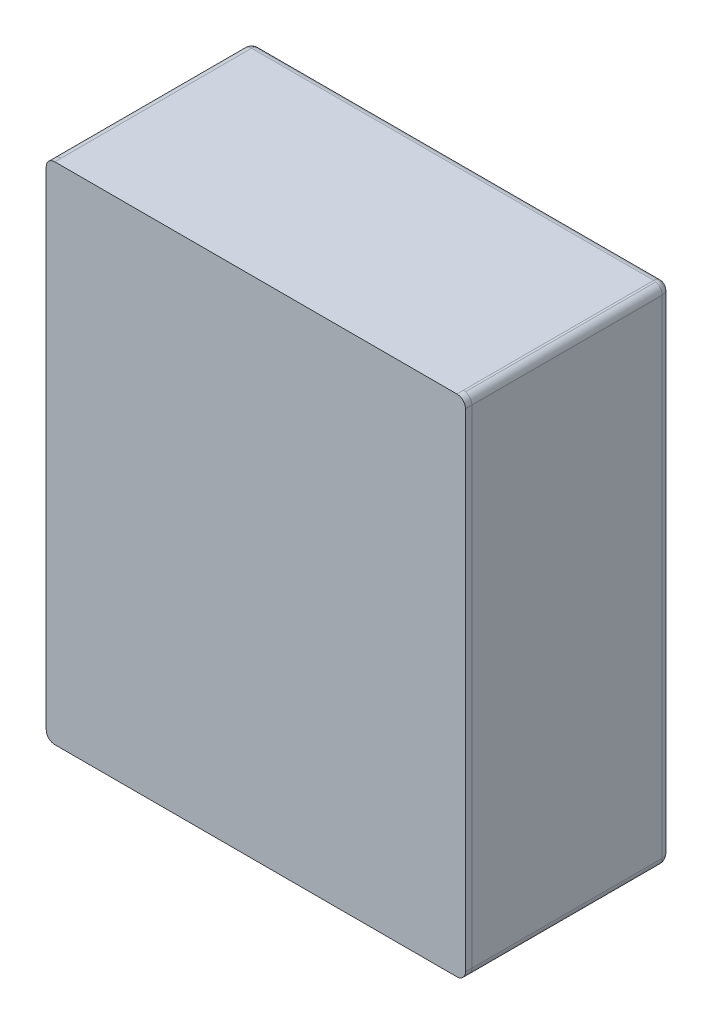
ISO-10303-21;
HEADER;
FILE_DESCRIPTION(('STEP AP214'),'2;1');
FILE_NAME('part.step','',(''),(''),'','','');
FILE_SCHEMA(('AUTOMOTIVE_DESIGN { 1 0 10303 214 1 1 1 1 }'));
ENDSEC;
DATA;
#1=APPLICATION_CONTEXT('core data for automotive mechanical design processes');
#2=APPLICATION_PROTOCOL_DEFINITION('international standard','automotive_design',2000,#1);
#3=PRODUCT_CONTEXT('',#1,'mechanical');
#4=PRODUCT('Part','Part','',(#3));
#5=PRODUCT_RELATED_PRODUCT_CATEGORY('part','',(#4));
#6=PRODUCT_DEFINITION_FORMATION('','',#4);
#7=PRODUCT_DEFINITION_CONTEXT('part definition',#1,'design');
#8=PRODUCT_DEFINITION('design','',#6,#7);
#9=PRODUCT_DEFINITION_SHAPE('','',#8);
#10=(LENGTH_UNIT() NAMED_UNIT(*) SI_UNIT(.MILLI.,.METRE.));
#11=(NAMED_UNIT(*) PLANE_ANGLE_UNIT() SI_UNIT($,.RADIAN.));
#12=(NAMED_UNIT(*) SI_UNIT($,.STERADIAN.) SOLID_ANGLE_UNIT());
#13=UNCERTAINTY_MEASURE_WITH_UNIT(LENGTH_MEASURE(1.E-05),#10,'distance_accuracy_value','');
#14=(GEOMETRIC_REPRESENTATION_CONTEXT(3) GLOBAL_UNCERTAINTY_ASSIGNED_CONTEXT((#13)) GLOBAL_UNIT_ASSIGNED_CONTEXT((#10,
#11,#12)) REPRESENTATION_CONTEXT('',''));
#15=CARTESIAN_POINT('',(0.,0.,0.));
#16=DIRECTION('',(0.,0.,1.));
#17=DIRECTION('',(1.,0.,0.));
#18=AXIS2_PLACEMENT_3D('',#15,#16,#17);
#19=CARTESIAN_POINT('',(0.,-3.81,5.08));
#20=DIRECTION('',(0.,0.,-1.));
#21=DIRECTION('',(-1.,0.,0.));
#22=AXIS2_PLACEMENT_3D('',#19,#20,#21);
#23=PLANE('',#22);
#24=CARTESIAN_POINT('',(-1.27,1.27,5.08));
#25=DIRECTION('',(0.,0.,-1.));
#26=DIRECTION('',(-1.,0.,0.));
#27=AXIS2_PLACEMENT_3D('',#24,#25,#26);
#28=CIRCLE('',#27,5.08);
#29=CARTESIAN_POINT('',(0.,-3.64868884968342,5.08));
#30=VERTEX_POINT('',#29);
#31=CARTESIAN_POINT('',(3.81,1.27,5.08));
#32=VERTEX_POINT('',#31);
#33=EDGE_CURVE('E109',#30,#32,#28,.F.);
#34=ORIENTED_EDGE('',*,*,#33,.F.);
#35=DIRECTION('',(0.,1.,0.));
#36=VECTOR('',#35,1.);
#37=CARTESIAN_POINT('',(0.,-3.81,5.08));
#38=LINE('',#37,#36);
#39=CARTESIAN_POINT('',(0.,295.748688849683,5.08));
#40=VERTEX_POINT('',#39);
#41=EDGE_CURVE('E12',#30,#40,#38,.T.);
#42=ORIENTED_EDGE('',*,*,#41,.T.);
#43=CARTESIAN_POINT('',(-1.27,290.83,5.08));
#44=DIRECTION('',(0.,0.,-1.));
#45=DIRECTION('',(-1.,0.,0.));
#46=AXIS2_PLACEMENT_3D('',#43,#44,#45);
#47=CIRCLE('',#46,5.08);
#48=CARTESIAN_POINT('',(3.81,290.83,5.08));
#49=VERTEX_POINT('',#48);
#50=EDGE_CURVE('E78',#49,#40,#47,.F.);
#51=ORIENTED_EDGE('',*,*,#50,.F.);
#52=DIRECTION('',(0.,1.,0.));
#53=VECTOR('',#52,1.);
#54=CARTESIAN_POINT('',(3.81,-3.81,5.08));
#55=LINE('',#54,#53);
#56=EDGE_CURVE('E82',#32,#49,#55,.T.);
#57=ORIENTED_EDGE('',*,*,#56,.F.);
#58=EDGE_LOOP('',(#34,#42,#51,#57));
#59=FACE_BOUND('',#58,.T.);
#60=ADVANCED_FACE('F62',(#59),#23,.T.);
#61=CARTESIAN_POINT('',(0.,-3.81,118.11));
#62=DIRECTION('',(0.,0.,1.));
#63=DIRECTION('',(1.,0.,0.));
#64=AXIS2_PLACEMENT_3D('',#61,#62,#63);
#65=PLANE('',#64);
#66=CARTESIAN_POINT('',(-1.27,290.83,118.11));
#67=DIRECTION('',(0.,0.,1.));
#68=DIRECTION('',(1.,0.,0.));
#69=AXIS2_PLACEMENT_3D('',#66,#67,#68);
#70=CIRCLE('',#69,5.08);
#71=CARTESIAN_POINT('',(3.81,290.83,118.11));
#72=VERTEX_POINT('',#71);
#73=CARTESIAN_POINT('',(0.,295.748688849683,118.11));
#74=VERTEX_POINT('',#73);
#75=EDGE_CURVE('E121',#72,#74,#70,.T.);
#76=ORIENTED_EDGE('',*,*,#75,.T.);
#77=DIRECTION('',(0.,1.,0.));
#78=VECTOR('',#77,1.);
#79=CARTESIAN_POINT('',(0.,-3.81,118.11));
#80=LINE('',#79,#78);
#81=CARTESIAN_POINT('',(0.,-3.64868884968342,118.11));
#82=VERTEX_POINT('',#81);
#83=EDGE_CURVE('E71',#82,#74,#80,.T.);
#84=ORIENTED_EDGE('',*,*,#83,.F.);
#85=CARTESIAN_POINT('',(-1.27,1.27,118.11));
#86=DIRECTION('',(0.,0.,1.));
#87=DIRECTION('',(1.,0.,0.));
#88=AXIS2_PLACEMENT_3D('',#85,#86,#87);
#89=CIRCLE('',#88,5.08);
#90=CARTESIAN_POINT('',(3.81,1.27,118.11));
#91=VERTEX_POINT('',#90);
#92=EDGE_CURVE('E66',#82,#91,#89,.T.);
#93=ORIENTED_EDGE('',*,*,#92,.T.);
#94=DIRECTION('',(0.,1.,0.));
#95=VECTOR('',#94,1.);
#96=CARTESIAN_POINT('',(3.81,-3.81,118.11));
#97=LINE('',#96,#95);
#98=EDGE_CURVE('E114',#91,#72,#97,.T.);
#99=ORIENTED_EDGE('',*,*,#98,.T.);
#100=EDGE_LOOP('',(#76,#84,#93,#99));
#101=FACE_BOUND('',#100,.T.);
#102=ADVANCED_FACE('F123',(#101),#65,.T.);
#103=CARTESIAN_POINT('',(0.,-3.81,118.11));
#104=DIRECTION('',(-1.,0.,0.));
#105=DIRECTION('',(0.,0.,1.));
#106=AXIS2_PLACEMENT_3D('',#103,#104,#105);
#107=PLANE('',#106);
#108=ORIENTED_EDGE('',*,*,#41,.F.);
#109=DIRECTION('',(0.,0.,-1.));
#110=VECTOR('',#109,1.);
#111=CARTESIAN_POINT('',(0.,-3.64868884968342,118.11));
#112=LINE('',#111,#110);
#113=EDGE_CURVE('E127',#82,#30,#112,.T.);
#114=ORIENTED_EDGE('',*,*,#113,.F.);
#115=ORIENTED_EDGE('',*,*,#83,.T.);
#116=DIRECTION('',(0.,0.,-1.));
#117=VECTOR('',#116,1.);
#118=CARTESIAN_POINT('',(0.,295.748688849683,118.11));
#119=LINE('',#118,#117);
#120=EDGE_CURVE('E120',#40,#74,#119,.F.);
#121=ORIENTED_EDGE('',*,*,#120,.F.);
#122=EDGE_LOOP('',(#108,#114,#115,#121));
#123=FACE_BOUND('',#122,.T.);
#124=ADVANCED_FACE('F135',(#123),#107,.T.);
#125=CARTESIAN_POINT('',(3.81,-3.81,118.11));
#126=DIRECTION('',(-1.,0.,0.));
#127=DIRECTION('',(0.,0.,1.));
#128=AXIS2_PLACEMENT_3D('',#125,#126,#127);
#129=PLANE('',#128);
#130=ORIENTED_EDGE('',*,*,#98,.F.);
#131=DIRECTION('',(0.,0.,-1.));
#132=VECTOR('',#131,1.);
#133=CARTESIAN_POINT('',(3.81,1.27,118.11));
#134=LINE('',#133,#132);
#135=EDGE_CURVE('E103',#91,#32,#134,.T.);
#136=ORIENTED_EDGE('',*,*,#135,.T.);
#137=ORIENTED_EDGE('',*,*,#56,.T.);
#138=DIRECTION('',(0.,0.,-1.));
#139=VECTOR('',#138,1.);
#140=CARTESIAN_POINT('',(3.81,290.83,118.11));
#141=LINE('',#140,#139);
#142=EDGE_CURVE('E111',#49,#72,#141,.F.);
#143=ORIENTED_EDGE('',*,*,#142,.T.);
#144=EDGE_LOOP('',(#130,#136,#137,#143));
#145=FACE_BOUND('',#144,.T.);
#146=ADVANCED_FACE('F115',(#145),#129,.F.);
#147=CARTESIAN_POINT('',(-1.27,290.83,118.11));
#148=DIRECTION('',(0.,0.,-1.));
#149=DIRECTION('',(-1.,0.,0.));
#150=AXIS2_PLACEMENT_3D('',#147,#148,#149);
#151=CYLINDRICAL_SURFACE('',#150,5.08);
#152=ORIENTED_EDGE('',*,*,#50,.T.);
#153=ORIENTED_EDGE('',*,*,#120,.T.);
#154=ORIENTED_EDGE('',*,*,#75,.F.);
#155=ORIENTED_EDGE('',*,*,#142,.F.);
#156=EDGE_LOOP('',(#152,#153,#154,#155));
#157=FACE_BOUND('',#156,.T.);
#158=ADVANCED_FACE('F64',(#157),#151,.T.);
#159=CARTESIAN_POINT('',(-1.27,1.27,118.11));
#160=DIRECTION('',(0.,0.,-1.));
#161=DIRECTION('',(-1.,0.,0.));
#162=AXIS2_PLACEMENT_3D('',#159,#160,#161);
#163=CYLINDRICAL_SURFACE('',#162,5.08);
#164=ORIENTED_EDGE('',*,*,#92,.F.);
#165=ORIENTED_EDGE('',*,*,#113,.T.);
#166=ORIENTED_EDGE('',*,*,#33,.T.);
#167=ORIENTED_EDGE('',*,*,#135,.F.);
#168=EDGE_LOOP('',(#164,#165,#166,#167));
#169=FACE_BOUND('',#168,.T.);
#170=ADVANCED_FACE('F105',(#169),#163,.T.);
#171=CLOSED_SHELL('',(#60,#102,#124,#146,#158,#170));
#172=MANIFOLD_SOLID_BREP('B2',#171);
#173=CARTESIAN_POINT('',(0.,-3.81,5.08));
#174=DIRECTION('',(0.,0.,-1.));
#175=DIRECTION('',(-1.,0.,0.));
#176=AXIS2_PLACEMENT_3D('',#173,#174,#175);
#177=PLANE('',#176);
#178=CARTESIAN_POINT('',(-1.27,1.27,5.08));
#179=DIRECTION('',(0.,0.,-1.));
#180=DIRECTION('',(-1.,0.,0.));
#181=AXIS2_PLACEMENT_3D('',#178,#179,#180);
#182=CIRCLE('',#181,5.08);
#183=CARTESIAN_POINT('',(0.,-3.64868884968342,5.08));
#184=VERTEX_POINT('',#183);
#185=CARTESIAN_POINT('',(3.81,1.27,5.08));
#186=VERTEX_POINT('',#185);
#187=EDGE_CURVE('E418',#184,#186,#182,.F.);
#188=ORIENTED_EDGE('',*,*,#187,.T.);
#189=DIRECTION('',(0.,1.,0.));
#190=VECTOR('',#189,1.);
#191=CARTESIAN_POINT('',(3.81,-3.81,5.08));
#192=LINE('',#191,#190);
#193=CARTESIAN_POINT('',(3.81,290.83,5.08));
#194=VERTEX_POINT('',#193);
#195=EDGE_CURVE('E414',#186,#194,#192,.T.);
#196=ORIENTED_EDGE('',*,*,#195,.T.);
#197=CARTESIAN_POINT('',(-1.27,290.83,5.08));
#198=DIRECTION('',(0.,0.,-1.));
#199=DIRECTION('',(-1.,0.,0.));
#200=AXIS2_PLACEMENT_3D('',#197,#198,#199);
#201=CIRCLE('',#200,5.08);
#202=CARTESIAN_POINT('',(0.,295.748688849683,5.08));
#203=VERTEX_POINT('',#202);
#204=EDGE_CURVE('E411',#194,#203,#201,.F.);
#205=ORIENTED_EDGE('',*,*,#204,.T.);
#206=DIRECTION('',(0.,1.,0.));
#207=VECTOR('',#206,1.);
#208=CARTESIAN_POINT('',(0.,-3.81,5.08));
#209=LINE('',#208,#207);
#210=CARTESIAN_POINT('',(0.,292.1,5.08));
#211=VERTEX_POINT('',#210);
#212=EDGE_CURVE('E60',#211,#203,#209,.T.);
#213=ORIENTED_EDGE('',*,*,#212,.F.);
#214=CARTESIAN_POINT('',(0.,0.,5.08));
#215=VERTEX_POINT('',#214);
#216=EDGE_CURVE('E212',#215,#211,#209,.T.);
#217=ORIENTED_EDGE('',*,*,#216,.F.);
#218=EDGE_CURVE('E210',#184,#215,#209,.T.);
#219=ORIENTED_EDGE('',*,*,#218,.F.);
#220=EDGE_LOOP('',(#188,#196,#205,#213,#217,#219));
#221=FACE_BOUND('',#220,.T.);
#222=ADVANCED_FACE('F200',(#221),#177,.F.);
#223=CARTESIAN_POINT('',(0.,-3.81,118.11));
#224=DIRECTION('',(-1.,0.,0.));
#225=DIRECTION('',(0.,0.,1.));
#226=AXIS2_PLACEMENT_3D('',#223,#224,#225);
#227=PLANE('',#226);
#228=DIRECTION('',(0.,0.,-1.));
#229=VECTOR('',#228,1.);
#230=CARTESIAN_POINT('',(0.,292.1,118.11));
#231=LINE('',#230,#229);
#232=CARTESIAN_POINT('',(0.,292.1,118.11));
#233=VERTEX_POINT('',#232);
#234=EDGE_CURVE('E219',#233,#211,#231,.T.);
#235=ORIENTED_EDGE('',*,*,#234,.T.);
#236=ORIENTED_EDGE('',*,*,#212,.T.);
#237=DIRECTION('',(0.,0.,-1.));
#238=VECTOR('',#237,1.);
#239=CARTESIAN_POINT('',(0.,295.748688849683,118.11));
#240=LINE('',#239,#238);
#241=CARTESIAN_POINT('',(0.,295.748688849683,118.11));
#242=VERTEX_POINT('',#241);
#243=EDGE_CURVE('E204',#203,#242,#240,.F.);
#244=ORIENTED_EDGE('',*,*,#243,.T.);
#245=DIRECTION('',(0.,1.,0.));
#246=VECTOR('',#245,1.);
#247=CARTESIAN_POINT('',(0.,-3.81,118.11));
#248=LINE('',#247,#246);
#249=EDGE_CURVE('E520',#233,#242,#248,.T.);
#250=ORIENTED_EDGE('',*,*,#249,.F.);
#251=EDGE_LOOP('',(#235,#236,#244,#250));
#252=FACE_BOUND('',#251,.T.);
#253=ADVANCED_FACE('F202',(#252),#227,.F.);
#254=CARTESIAN_POINT('',(0.,-3.64868884968342,118.11));
#255=VERTEX_POINT('',#254);
#256=CARTESIAN_POINT('',(0.,0.,118.11));
#257=VERTEX_POINT('',#256);
#258=EDGE_CURVE('E524',#255,#257,#248,.T.);
#259=ORIENTED_EDGE('',*,*,#258,.F.);
#260=DIRECTION('',(0.,0.,-1.));
#261=VECTOR('',#260,1.);
#262=CARTESIAN_POINT('',(0.,-3.64868884968342,118.11));
#263=LINE('',#262,#261);
#264=EDGE_CURVE('E526',#255,#184,#263,.T.);
#265=ORIENTED_EDGE('',*,*,#264,.T.);
#266=ORIENTED_EDGE('',*,*,#218,.T.);
#267=DIRECTION('',(0.,0.,-1.));
#268=VECTOR('',#267,1.);
#269=CARTESIAN_POINT('',(0.,0.,118.11));
#270=LINE('',#269,#268);
#271=EDGE_CURVE('E227',#257,#215,#270,.T.);
#272=ORIENTED_EDGE('',*,*,#271,.F.);
#273=EDGE_LOOP('',(#259,#265,#266,#272));
#274=FACE_BOUND('',#273,.T.);
#275=ADVANCED_FACE('F627',(#274),#227,.F.);
#276=CARTESIAN_POINT('',(-240.03,1.27,5.08));
#277=DIRECTION('',(0.,0.,1.));
#278=DIRECTION('',(1.,0.,0.));
#279=AXIS2_PLACEMENT_3D('',#276,#277,#278);
#280=SPHERICAL_SURFACE('',#279,5.08);
#281=CARTESIAN_POINT('',(-240.03,1.27,5.08));
#282=DIRECTION('',(1.,0.,0.));
#283=DIRECTION('',(0.,0.,-1.));
#284=AXIS2_PLACEMENT_3D('',#281,#282,#283);
#285=CIRCLE('',#284,5.08);
#286=CARTESIAN_POINT('',(-240.03,-3.81,5.08));
#287=VERTEX_POINT('',#286);
#288=CARTESIAN_POINT('',(-240.03,1.27,0.));
#289=VERTEX_POINT('',#288);
#290=EDGE_CURVE('E475',#287,#289,#285,.T.);
#291=ORIENTED_EDGE('',*,*,#290,.F.);
#292=CARTESIAN_POINT('',(-240.03,1.27,5.08));
#293=DIRECTION('',(0.,0.,-1.));
#294=DIRECTION('',(-1.,0.,0.));
#295=AXIS2_PLACEMENT_3D('',#292,#293,#294);
#296=CIRCLE('',#295,5.08);
#297=CARTESIAN_POINT('',(-245.11,1.27,5.08));
#298=VERTEX_POINT('',#297);
#299=EDGE_CURVE('E439',#298,#287,#296,.F.);
#300=ORIENTED_EDGE('',*,*,#299,.F.);
#301=CARTESIAN_POINT('',(-240.03,1.27,5.08));
#302=DIRECTION('',(0.,1.,0.));
#303=DIRECTION('',(0.,0.,1.));
#304=AXIS2_PLACEMENT_3D('',#301,#302,#303);
#305=CIRCLE('',#304,5.08);
#306=EDGE_CURVE('E479',#289,#298,#305,.T.);
#307=ORIENTED_EDGE('',*,*,#306,.F.);
#308=EDGE_LOOP('',(#291,#300,#307));
#309=FACE_BOUND('',#308,.T.);
#310=ADVANCED_FACE('F675',(#309),#280,.T.);
#311=CARTESIAN_POINT('',(-240.03,-3.81,5.08));
#312=DIRECTION('',(0.,-1.,0.));
#313=DIRECTION('',(0.,0.,-1.));
#314=AXIS2_PLACEMENT_3D('',#311,#312,#313);
#315=CYLINDRICAL_SURFACE('',#314,5.08);
#316=ORIENTED_EDGE('',*,*,#306,.T.);
#317=DIRECTION('',(0.,-1.,0.));
#318=VECTOR('',#317,1.);
#319=CARTESIAN_POINT('',(-245.11,-3.81,5.08));
#320=LINE('',#319,#318);
#321=CARTESIAN_POINT('',(-245.11,290.83,5.08));
#322=VERTEX_POINT('',#321);
#323=EDGE_CURVE('E442',#322,#298,#320,.T.);
#324=ORIENTED_EDGE('',*,*,#323,.F.);
#325=CARTESIAN_POINT('',(-240.03,290.83,5.08));
#326=DIRECTION('',(0.,1.,0.));
#327=DIRECTION('',(0.,0.,1.));
#328=AXIS2_PLACEMENT_3D('',#325,#326,#327);
#329=CIRCLE('',#328,5.08);
#330=CARTESIAN_POINT('',(-240.03,290.83,0.));
#331=VERTEX_POINT('',#330);
#332=EDGE_CURVE('E471',#331,#322,#329,.T.);
#333=ORIENTED_EDGE('',*,*,#332,.F.);
#334=DIRECTION('',(0.,-1.,0.));
#335=VECTOR('',#334,1.);
#336=CARTESIAN_POINT('',(-240.03,0.,0.));
#337=LINE('',#336,#335);
#338=EDGE_CURVE('E422',#289,#331,#337,.F.);
#339=ORIENTED_EDGE('',*,*,#338,.F.);
#340=EDGE_LOOP('',(#316,#324,#333,#339));
#341=FACE_BOUND('',#340,.T.);
#342=ADVANCED_FACE('F678',(#341),#315,.T.);
#343=CARTESIAN_POINT('',(-240.03,290.83,5.08));
#344=DIRECTION('',(0.,0.,1.));
#345=DIRECTION('',(1.,0.,0.));
#346=AXIS2_PLACEMENT_3D('',#343,#344,#345);
#347=SPHERICAL_SURFACE('',#346,5.08);
#348=ORIENTED_EDGE('',*,*,#332,.T.);
#349=CARTESIAN_POINT('',(-240.03,290.83,5.08));
#350=DIRECTION('',(0.,0.,-1.));
#351=DIRECTION('',(-1.,0.,0.));
#352=AXIS2_PLACEMENT_3D('',#349,#350,#351);
#353=CIRCLE('',#352,5.08);
#354=CARTESIAN_POINT('',(-240.03,295.91,5.08));
#355=VERTEX_POINT('',#354);
#356=EDGE_CURVE('E445',#355,#322,#353,.F.);
#357=ORIENTED_EDGE('',*,*,#356,.F.);
#358=CARTESIAN_POINT('',(-240.03,290.83,5.08));
#359=DIRECTION('',(1.,0.,0.));
#360=DIRECTION('',(0.,0.,-1.));
#361=AXIS2_PLACEMENT_3D('',#358,#359,#360);
#362=CIRCLE('',#361,5.08);
#363=EDGE_CURVE('E463',#331,#355,#362,.T.);
#364=ORIENTED_EDGE('',*,*,#363,.F.);
#365=EDGE_LOOP('',(#348,#357,#364));
#366=FACE_BOUND('',#365,.T.);
#367=ADVANCED_FACE('F682',(#366),#347,.T.);
#368=CARTESIAN_POINT('',(-240.03,290.83,118.11));
#369=DIRECTION('',(0.,0.,-1.));
#370=DIRECTION('',(-1.,0.,0.));
#371=AXIS2_PLACEMENT_3D('',#368,#369,#370);
#372=CYLINDRICAL_SURFACE('',#371,5.08);
#373=DIRECTION('',(0.,0.,-1.));
#374=VECTOR('',#373,1.);
#375=CARTESIAN_POINT('',(-240.03,295.91,118.11));
#376=LINE('',#375,#374);
#377=CARTESIAN_POINT('',(-240.03,295.91,118.11));
#378=VERTEX_POINT('',#377);
#379=EDGE_CURVE('E381',#355,#378,#376,.F.);
#380=ORIENTED_EDGE('',*,*,#379,.F.);
#381=ORIENTED_EDGE('',*,*,#356,.T.);
#382=DIRECTION('',(0.,0.,-1.));
#383=VECTOR('',#382,1.);
#384=CARTESIAN_POINT('',(-245.11,290.83,118.11));
#385=LINE('',#384,#383);
#386=CARTESIAN_POINT('',(-245.11,290.83,118.11));
#387=VERTEX_POINT('',#386);
#388=EDGE_CURVE('E382',#387,#322,#385,.T.);
#389=ORIENTED_EDGE('',*,*,#388,.F.);
#390=CARTESIAN_POINT('',(-240.03,290.83,118.11));
#391=DIRECTION('',(0.,0.,1.));
#392=DIRECTION('',(1.,0.,0.));
#393=AXIS2_PLACEMENT_3D('',#390,#391,#392);
#394=CIRCLE('',#393,5.08);
#395=EDGE_CURVE('E401',#378,#387,#394,.T.);
#396=ORIENTED_EDGE('',*,*,#395,.F.);
#397=EDGE_LOOP('',(#380,#381,#389,#396));
#398=FACE_BOUND('',#397,.T.);
#399=ADVANCED_FACE('F690',(#398),#372,.T.);
#400=CARTESIAN_POINT('',(-240.03,1.27,118.11));
#401=DIRECTION('',(0.,0.,-1.));
#402=DIRECTION('',(-1.,0.,0.));
#403=AXIS2_PLACEMENT_3D('',#400,#401,#402);
#404=CYLINDRICAL_SURFACE('',#403,5.08);
#405=DIRECTION('',(0.,0.,-1.));
#406=VECTOR('',#405,1.);
#407=CARTESIAN_POINT('',(-245.11,1.27,118.11));
#408=LINE('',#407,#406);
#409=CARTESIAN_POINT('',(-245.11,1.27,118.11));
#410=VERTEX_POINT('',#409);
#411=EDGE_CURVE('E389',#298,#410,#408,.F.);
#412=ORIENTED_EDGE('',*,*,#411,.F.);
#413=ORIENTED_EDGE('',*,*,#299,.T.);
#414=DIRECTION('',(0.,0.,-1.));
#415=VECTOR('',#414,1.);
#416=CARTESIAN_POINT('',(-240.03,-3.81,118.11));
#417=LINE('',#416,#415);
#418=CARTESIAN_POINT('',(-240.03,-3.81,118.11));
#419=VERTEX_POINT('',#418);
#420=EDGE_CURVE('E407',#419,#287,#417,.T.);
#421=ORIENTED_EDGE('',*,*,#420,.F.);
#422=CARTESIAN_POINT('',(-240.03,1.27,118.11));
#423=DIRECTION('',(0.,0.,1.));
#424=DIRECTION('',(1.,0.,0.));
#425=AXIS2_PLACEMENT_3D('',#422,#423,#424);
#426=CIRCLE('',#425,5.08);
#427=EDGE_CURVE('E397',#410,#419,#426,.T.);
#428=ORIENTED_EDGE('',*,*,#427,.F.);
#429=EDGE_LOOP('',(#412,#413,#421,#428));
#430=FACE_BOUND('',#429,.T.);
#431=ADVANCED_FACE('F592',(#430),#404,.T.);
#432=CARTESIAN_POINT('',(-240.03,1.27,118.11));
#433=DIRECTION('',(0.,0.,1.));
#434=DIRECTION('',(1.,0.,0.));
#435=AXIS2_PLACEMENT_3D('',#432,#433,#434);
#436=CYLINDRICAL_SURFACE('',#435,5.08);
#437=ORIENTED_EDGE('',*,*,#427,.T.);
#438=DIRECTION('',(0.,0.,1.));
#439=VECTOR('',#438,1.);
#440=CARTESIAN_POINT('',(-240.03,-3.81,118.11));
#441=LINE('',#440,#439);
#442=CARTESIAN_POINT('',(-240.03,-3.81,121.92));
#443=VERTEX_POINT('',#442);
#444=EDGE_CURVE('E515',#443,#419,#441,.F.);
#445=ORIENTED_EDGE('',*,*,#444,.F.);
#446=CARTESIAN_POINT('',(-240.03,1.27,121.92));
#447=DIRECTION('',(0.,0.,1.));
#448=DIRECTION('',(1.,0.,0.));
#449=AXIS2_PLACEMENT_3D('',#446,#447,#448);
#450=CIRCLE('',#449,5.08);
#451=CARTESIAN_POINT('',(-245.11,1.27,121.92));
#452=VERTEX_POINT('',#451);
#453=EDGE_CURVE('E494',#452,#443,#450,.T.);
#454=ORIENTED_EDGE('',*,*,#453,.F.);
#455=DIRECTION('',(0.,0.,1.));
#456=VECTOR('',#455,1.);
#457=CARTESIAN_POINT('',(-245.11,1.27,118.11));
#458=LINE('',#457,#456);
#459=EDGE_CURVE('E373',#410,#452,#458,.T.);
#460=ORIENTED_EDGE('',*,*,#459,.F.);
#461=EDGE_LOOP('',(#437,#445,#454,#460));
#462=FACE_BOUND('',#461,.T.);
#463=ADVANCED_FACE('F595',(#462),#436,.T.);
#464=CARTESIAN_POINT('',(-245.11,-3.81,118.11));
#465=DIRECTION('',(1.,0.,0.));
#466=DIRECTION('',(0.,0.,-1.));
#467=AXIS2_PLACEMENT_3D('',#464,#465,#466);
#468=PLANE('',#467);
#469=DIRECTION('',(0.,1.,0.));
#470=VECTOR('',#469,1.);
#471=CARTESIAN_POINT('',(-245.11,-3.81,121.92));
#472=LINE('',#471,#470);
#473=CARTESIAN_POINT('',(-245.11,290.83,121.92));
#474=VERTEX_POINT('',#473);
#475=EDGE_CURVE('E457',#452,#474,#472,.T.);
#476=ORIENTED_EDGE('',*,*,#475,.T.);
#477=DIRECTION('',(0.,0.,-1.));
#478=VECTOR('',#477,1.);
#479=CARTESIAN_POINT('',(-245.11,290.83,118.11));
#480=LINE('',#479,#478);
#481=EDGE_CURVE('E508',#474,#387,#480,.T.);
#482=ORIENTED_EDGE('',*,*,#481,.T.);
#483=ORIENTED_EDGE('',*,*,#388,.T.);
#484=ORIENTED_EDGE('',*,*,#323,.T.);
#485=ORIENTED_EDGE('',*,*,#411,.T.);
#486=ORIENTED_EDGE('',*,*,#459,.T.);
#487=EDGE_LOOP('',(#476,#482,#483,#484,#485,#486));
#488=FACE_BOUND('',#487,.T.);
#489=ADVANCED_FACE('F585',(#488),#468,.F.);
#490=CARTESIAN_POINT('',(-240.03,290.83,118.11));
#491=DIRECTION('',(0.,0.,-1.));
#492=DIRECTION('',(-1.,0.,0.));
#493=AXIS2_PLACEMENT_3D('',#490,#491,#492);
#494=CYLINDRICAL_SURFACE('',#493,5.08);
#495=CARTESIAN_POINT('',(-240.03,290.83,121.92));
#496=DIRECTION('',(0.,0.,1.));
#497=DIRECTION('',(1.,0.,0.));
#498=AXIS2_PLACEMENT_3D('',#495,#496,#497);
#499=CIRCLE('',#498,5.08);
#500=CARTESIAN_POINT('',(-240.03,295.91,121.92));
#501=VERTEX_POINT('',#500);
#502=EDGE_CURVE('E497',#501,#474,#499,.T.);
#503=ORIENTED_EDGE('',*,*,#502,.F.);
#504=DIRECTION('',(0.,0.,-1.));
#505=VECTOR('',#504,1.);
#506=CARTESIAN_POINT('',(-240.03,295.91,118.11));
#507=LINE('',#506,#505);
#508=EDGE_CURVE('E374',#378,#501,#507,.F.);
#509=ORIENTED_EDGE('',*,*,#508,.F.);
#510=ORIENTED_EDGE('',*,*,#395,.T.);
#511=ORIENTED_EDGE('',*,*,#481,.F.);
#512=EDGE_LOOP('',(#503,#509,#510,#511));
#513=FACE_BOUND('',#512,.T.);
#514=ADVANCED_FACE('F667',(#513),#494,.T.);
#515=CARTESIAN_POINT('',(3.81,1.27,5.08));
#516=DIRECTION('',(1.,0.,0.));
#517=DIRECTION('',(0.,0.,-1.));
#518=AXIS2_PLACEMENT_3D('',#515,#516,#517);
#519=CYLINDRICAL_SURFACE('',#518,5.08);
#520=ORIENTED_EDGE('',*,*,#290,.T.);
#521=DIRECTION('',(1.,0.,0.));
#522=VECTOR('',#521,1.);
#523=CARTESIAN_POINT('',(0.,1.27,0.));
#524=LINE('',#523,#522);
#525=CARTESIAN_POINT('',(-1.27,1.27,0.));
#526=VERTEX_POINT('',#525);
#527=EDGE_CURVE('E425',#526,#289,#524,.F.);
#528=ORIENTED_EDGE('',*,*,#527,.F.);
#529=CARTESIAN_POINT('',(-1.27,1.27,5.08));
#530=DIRECTION('',(1.,0.,0.));
#531=DIRECTION('',(0.,0.,-1.));
#532=AXIS2_PLACEMENT_3D('',#529,#530,#531);
#533=CIRCLE('',#532,5.08);
#534=CARTESIAN_POINT('',(-1.27,-3.81,5.08));
#535=VERTEX_POINT('',#534);
#536=EDGE_CURVE('E467',#535,#526,#533,.T.);
#537=ORIENTED_EDGE('',*,*,#536,.F.);
#538=DIRECTION('',(1.,0.,0.));
#539=VECTOR('',#538,1.);
#540=CARTESIAN_POINT('',(3.81,-3.81,5.08));
#541=LINE('',#540,#539);
#542=EDGE_CURVE('E436',#287,#535,#541,.T.);
#543=ORIENTED_EDGE('',*,*,#542,.F.);
#544=EDGE_LOOP('',(#520,#528,#537,#543));
#545=FACE_BOUND('',#544,.T.);
#546=ADVANCED_FACE('F670',(#545),#519,.T.);
#547=CARTESIAN_POINT('',(0.,0.,0.));
#548=DIRECTION('',(0.,0.,1.));
#549=DIRECTION('',(1.,0.,0.));
#550=AXIS2_PLACEMENT_3D('',#547,#548,#549);
#551=PLANE('',#550);
#552=DIRECTION('',(-1.,0.,0.));
#553=VECTOR('',#552,1.);
#554=CARTESIAN_POINT('',(0.,290.83,0.));
#555=LINE('',#554,#553);
#556=CARTESIAN_POINT('',(-1.27,290.83,0.));
#557=VERTEX_POINT('',#556);
#558=EDGE_CURVE('E419',#331,#557,#555,.F.);
#559=ORIENTED_EDGE('',*,*,#558,.T.);
#560=DIRECTION('',(0.,1.,0.));
#561=VECTOR('',#560,1.);
#562=CARTESIAN_POINT('',(-1.27,0.,0.));
#563=LINE('',#562,#561);
#564=EDGE_CURVE('E428',#557,#526,#563,.F.);
#565=ORIENTED_EDGE('',*,*,#564,.T.);
#566=ORIENTED_EDGE('',*,*,#527,.T.);
#567=ORIENTED_EDGE('',*,*,#338,.T.);
#568=EDGE_LOOP('',(#559,#565,#566,#567));
#569=FACE_BOUND('',#568,.T.);
#570=ADVANCED_FACE('F686',(#569),#551,.F.);
#571=CARTESIAN_POINT('',(-1.27,1.27,5.08));
#572=DIRECTION('',(0.,0.,1.));
#573=DIRECTION('',(1.,0.,0.));
#574=AXIS2_PLACEMENT_3D('',#571,#572,#573);
#575=SPHERICAL_SURFACE('',#574,5.08);
#576=EDGE_CURVE('E432',#535,#184,#182,.F.);
#577=ORIENTED_EDGE('',*,*,#576,.F.);
#578=ORIENTED_EDGE('',*,*,#536,.T.);
#579=CARTESIAN_POINT('',(-1.27,1.27,5.08));
#580=DIRECTION('',(0.,1.,0.));
#581=DIRECTION('',(0.,0.,1.));
#582=AXIS2_PLACEMENT_3D('',#579,#580,#581);
#583=CIRCLE('',#582,5.08);
#584=EDGE_CURVE('E460',#186,#526,#583,.T.);
#585=ORIENTED_EDGE('',*,*,#584,.F.);
#586=ORIENTED_EDGE('',*,*,#187,.F.);
#587=EDGE_LOOP('',(#577,#578,#585,#586));
#588=FACE_BOUND('',#587,.T.);
#589=ADVANCED_FACE('F692',(#588),#575,.T.);
#590=CARTESIAN_POINT('',(-1.27,-3.81,5.08));
#591=DIRECTION('',(0.,1.,0.));
#592=DIRECTION('',(0.,0.,1.));
#593=AXIS2_PLACEMENT_3D('',#590,#591,#592);
#594=CYLINDRICAL_SURFACE('',#593,5.08);
#595=ORIENTED_EDGE('',*,*,#584,.T.);
#596=ORIENTED_EDGE('',*,*,#564,.F.);
#597=CARTESIAN_POINT('',(-1.27,290.83,5.08));
#598=DIRECTION('',(0.,1.,0.));
#599=DIRECTION('',(0.,0.,1.));
#600=AXIS2_PLACEMENT_3D('',#597,#598,#599);
#601=CIRCLE('',#600,5.08);
#602=EDGE_CURVE('E452',#194,#557,#601,.T.);
#603=ORIENTED_EDGE('',*,*,#602,.F.);
#604=ORIENTED_EDGE('',*,*,#195,.F.);
#605=EDGE_LOOP('',(#595,#596,#603,#604));
#606=FACE_BOUND('',#605,.T.);
#607=ADVANCED_FACE('F695',(#606),#594,.T.);
#608=CARTESIAN_POINT('',(3.81,-3.81,118.11));
#609=DIRECTION('',(-1.,0.,0.));
#610=DIRECTION('',(0.,0.,1.));
#611=AXIS2_PLACEMENT_3D('',#608,#609,#610);
#612=PLANE('',#611);
#613=DIRECTION('',(0.,0.,-1.));
#614=VECTOR('',#613,1.);
#615=CARTESIAN_POINT('',(3.81,1.27,118.11));
#616=LINE('',#615,#614);
#617=CARTESIAN_POINT('',(3.81,1.27,121.92));
#618=VERTEX_POINT('',#617);
#619=CARTESIAN_POINT('',(3.81,1.27,118.11));
#620=VERTEX_POINT('',#619);
#621=EDGE_CURVE('E451',#618,#620,#616,.T.);
#622=ORIENTED_EDGE('',*,*,#621,.T.);
#623=DIRECTION('',(0.,1.,0.));
#624=VECTOR('',#623,1.);
#625=CARTESIAN_POINT('',(3.81,-3.81,118.11));
#626=LINE('',#625,#624);
#627=CARTESIAN_POINT('',(3.81,290.83,118.11));
#628=VERTEX_POINT('',#627);
#629=EDGE_CURVE('E517',#620,#628,#626,.T.);
#630=ORIENTED_EDGE('',*,*,#629,.T.);
#631=DIRECTION('',(0.,0.,1.));
#632=VECTOR('',#631,1.);
#633=CARTESIAN_POINT('',(3.81,290.83,118.11));
#634=LINE('',#633,#632);
#635=CARTESIAN_POINT('',(3.81,290.83,121.92));
#636=VERTEX_POINT('',#635);
#637=EDGE_CURVE('E487',#628,#636,#634,.T.);
#638=ORIENTED_EDGE('',*,*,#637,.T.);
#639=DIRECTION('',(0.,-1.,0.));
#640=VECTOR('',#639,1.);
#641=CARTESIAN_POINT('',(3.81,-3.81,121.92));
#642=LINE('',#641,#640);
#643=EDGE_CURVE('E611',#636,#618,#642,.T.);
#644=ORIENTED_EDGE('',*,*,#643,.T.);
#645=EDGE_LOOP('',(#622,#630,#638,#644));
#646=FACE_BOUND('',#645,.T.);
#647=ADVANCED_FACE('F617',(#646),#612,.F.);
#648=CARTESIAN_POINT('',(-1.27,1.27,118.11));
#649=DIRECTION('',(0.,0.,-1.));
#650=DIRECTION('',(-1.,0.,0.));
#651=AXIS2_PLACEMENT_3D('',#648,#649,#650);
#652=CYLINDRICAL_SURFACE('',#651,5.08);
#653=ORIENTED_EDGE('',*,*,#264,.F.);
#654=CARTESIAN_POINT('',(-1.27,1.27,118.11));
#655=DIRECTION('',(0.,0.,1.));
#656=DIRECTION('',(1.,0.,0.));
#657=AXIS2_PLACEMENT_3D('',#654,#655,#656);
#658=CIRCLE('',#657,5.08);
#659=CARTESIAN_POINT('',(-1.27,-3.81,118.11));
#660=VERTEX_POINT('',#659);
#661=EDGE_CURVE('E363',#660,#255,#658,.T.);
#662=ORIENTED_EDGE('',*,*,#661,.F.);
#663=DIRECTION('',(0.,0.,-1.));
#664=VECTOR('',#663,1.);
#665=CARTESIAN_POINT('',(-1.27,-3.81,118.11));
#666=LINE('',#665,#664);
#667=EDGE_CURVE('E404',#535,#660,#666,.F.);
#668=ORIENTED_EDGE('',*,*,#667,.F.);
#669=ORIENTED_EDGE('',*,*,#576,.T.);
#670=EDGE_LOOP('',(#653,#662,#668,#669));
#671=FACE_BOUND('',#670,.T.);
#672=ADVANCED_FACE('F624',(#671),#652,.T.);
#673=CARTESIAN_POINT('',(3.81,-3.81,118.11));
#674=DIRECTION('',(0.,1.,0.));
#675=DIRECTION('',(0.,0.,1.));
#676=AXIS2_PLACEMENT_3D('',#673,#674,#675);
#677=PLANE('',#676);
#678=DIRECTION('',(1.,0.,0.));
#679=VECTOR('',#678,1.);
#680=CARTESIAN_POINT('',(-544.854215123495,-3.81,121.92));
#681=LINE('',#680,#679);
#682=CARTESIAN_POINT('',(-1.26999999999999,-3.81,121.92));
#683=VERTEX_POINT('',#682);
#684=EDGE_CURVE('E601',#443,#683,#681,.T.);
#685=ORIENTED_EDGE('',*,*,#684,.F.);
#686=ORIENTED_EDGE('',*,*,#444,.T.);
#687=ORIENTED_EDGE('',*,*,#420,.T.);
#688=ORIENTED_EDGE('',*,*,#542,.T.);
#689=ORIENTED_EDGE('',*,*,#667,.T.);
#690=DIRECTION('',(0.,0.,-1.));
#691=VECTOR('',#690,1.);
#692=CARTESIAN_POINT('',(-1.27,-3.81,118.11));
#693=LINE('',#692,#691);
#694=EDGE_CURVE('E512',#660,#683,#693,.F.);
#695=ORIENTED_EDGE('',*,*,#694,.T.);
#696=EDGE_LOOP('',(#685,#686,#687,#688,#689,#695));
#697=FACE_BOUND('',#696,.T.);
#698=ADVANCED_FACE('F604',(#697),#677,.F.);
#699=CARTESIAN_POINT('',(-544.854215123495,-3.81,121.92));
#700=DIRECTION('',(0.,0.,1.));
#701=DIRECTION('',(1.,0.,0.));
#702=AXIS2_PLACEMENT_3D('',#699,#700,#701);
#703=PLANE('',#702);
#704=ORIENTED_EDGE('',*,*,#643,.F.);
#705=CARTESIAN_POINT('',(-1.27,290.83,121.92));
#706=DIRECTION('',(0.,0.,1.));
#707=DIRECTION('',(1.,0.,0.));
#708=AXIS2_PLACEMENT_3D('',#705,#706,#707);
#709=CIRCLE('',#708,5.08);
#710=CARTESIAN_POINT('',(-1.26999999999999,295.91,121.92));
#711=VERTEX_POINT('',#710);
#712=EDGE_CURVE('E500',#636,#711,#709,.T.);
#713=ORIENTED_EDGE('',*,*,#712,.T.);
#714=DIRECTION('',(1.,0.,0.));
#715=VECTOR('',#714,1.);
#716=CARTESIAN_POINT('',(-544.854215123495,295.91,121.92));
#717=LINE('',#716,#715);
#718=EDGE_CURVE('E371',#501,#711,#717,.T.);
#719=ORIENTED_EDGE('',*,*,#718,.F.);
#720=ORIENTED_EDGE('',*,*,#502,.T.);
#721=ORIENTED_EDGE('',*,*,#475,.F.);
#722=ORIENTED_EDGE('',*,*,#453,.T.);
#723=ORIENTED_EDGE('',*,*,#684,.T.);
#724=CARTESIAN_POINT('',(-1.27,1.27,121.92));
#725=DIRECTION('',(0.,0.,1.));
#726=DIRECTION('',(1.,0.,0.));
#727=AXIS2_PLACEMENT_3D('',#724,#725,#726);
#728=CIRCLE('',#727,5.08);
#729=EDGE_CURVE('E491',#683,#618,#728,.T.);
#730=ORIENTED_EDGE('',*,*,#729,.T.);
#731=EDGE_LOOP('',(#704,#713,#719,#720,#721,#722,#723,#730));
#732=FACE_BOUND('',#731,.T.);
#733=ADVANCED_FACE('F600',(#732),#703,.T.);
#734=CARTESIAN_POINT('',(-1.27,1.27,118.11));
#735=DIRECTION('',(0.,0.,-1.));
#736=DIRECTION('',(-1.,0.,0.));
#737=AXIS2_PLACEMENT_3D('',#734,#735,#736);
#738=CYLINDRICAL_SURFACE('',#737,5.08);
#739=ORIENTED_EDGE('',*,*,#729,.F.);
#740=ORIENTED_EDGE('',*,*,#694,.F.);
#741=ORIENTED_EDGE('',*,*,#661,.T.);
#742=EDGE_CURVE('E386',#255,#620,#658,.T.);
#743=ORIENTED_EDGE('',*,*,#742,.T.);
#744=ORIENTED_EDGE('',*,*,#621,.F.);
#745=EDGE_LOOP('',(#739,#740,#741,#743,#744));
#746=FACE_BOUND('',#745,.T.);
#747=ADVANCED_FACE('F619',(#746),#738,.T.);
#748=CARTESIAN_POINT('',(3.81,295.91,118.11));
#749=DIRECTION('',(0.,-1.,0.));
#750=DIRECTION('',(0.,0.,-1.));
#751=AXIS2_PLACEMENT_3D('',#748,#749,#750);
#752=PLANE('',#751);
#753=ORIENTED_EDGE('',*,*,#718,.T.);
#754=DIRECTION('',(0.,0.,1.));
#755=VECTOR('',#754,1.);
#756=CARTESIAN_POINT('',(-1.27,295.91,118.11));
#757=LINE('',#756,#755);
#758=CARTESIAN_POINT('',(-1.27,295.91,118.11));
#759=VERTEX_POINT('',#758);
#760=EDGE_CURVE('E355',#711,#759,#757,.F.);
#761=ORIENTED_EDGE('',*,*,#760,.T.);
#762=DIRECTION('',(0.,0.,-1.));
#763=VECTOR('',#762,1.);
#764=CARTESIAN_POINT('',(-1.27,295.91,118.11));
#765=LINE('',#764,#763);
#766=CARTESIAN_POINT('',(-1.27,295.91,5.08));
#767=VERTEX_POINT('',#766);
#768=EDGE_CURVE('E369',#759,#767,#765,.T.);
#769=ORIENTED_EDGE('',*,*,#768,.T.);
#770=DIRECTION('',(-1.,0.,0.));
#771=VECTOR('',#770,1.);
#772=CARTESIAN_POINT('',(3.81,295.91,5.08));
#773=LINE('',#772,#771);
#774=EDGE_CURVE('E448',#767,#355,#773,.T.);
#775=ORIENTED_EDGE('',*,*,#774,.T.);
#776=ORIENTED_EDGE('',*,*,#379,.T.);
#777=ORIENTED_EDGE('',*,*,#508,.T.);
#778=EDGE_LOOP('',(#753,#761,#769,#775,#776,#777));
#779=FACE_BOUND('',#778,.T.);
#780=ADVANCED_FACE('F368',(#779),#752,.F.);
#781=CARTESIAN_POINT('',(-1.27,290.83,118.11));
#782=DIRECTION('',(0.,0.,-1.));
#783=DIRECTION('',(-1.,0.,0.));
#784=AXIS2_PLACEMENT_3D('',#781,#782,#783);
#785=CYLINDRICAL_SURFACE('',#784,5.08);
#786=ORIENTED_EDGE('',*,*,#243,.F.);
#787=EDGE_CURVE('E378',#203,#767,#201,.F.);
#788=ORIENTED_EDGE('',*,*,#787,.T.);
#789=ORIENTED_EDGE('',*,*,#768,.F.);
#790=CARTESIAN_POINT('',(-1.27,290.83,118.11));
#791=DIRECTION('',(0.,0.,1.));
#792=DIRECTION('',(1.,0.,0.));
#793=AXIS2_PLACEMENT_3D('',#790,#791,#792);
#794=CIRCLE('',#793,5.08);
#795=EDGE_CURVE('E352',#242,#759,#794,.T.);
#796=ORIENTED_EDGE('',*,*,#795,.F.);
#797=EDGE_LOOP('',(#786,#788,#789,#796));
#798=FACE_BOUND('',#797,.T.);
#799=ADVANCED_FACE('F376',(#798),#785,.T.);
#800=CARTESIAN_POINT('',(-1.27,290.83,118.11));
#801=DIRECTION('',(0.,0.,1.));
#802=DIRECTION('',(1.,0.,0.));
#803=AXIS2_PLACEMENT_3D('',#800,#801,#802);
#804=CYLINDRICAL_SURFACE('',#803,5.08);
#805=EDGE_CURVE('E358',#628,#242,#794,.T.);
#806=ORIENTED_EDGE('',*,*,#805,.T.);
#807=ORIENTED_EDGE('',*,*,#795,.T.);
#808=ORIENTED_EDGE('',*,*,#760,.F.);
#809=ORIENTED_EDGE('',*,*,#712,.F.);
#810=ORIENTED_EDGE('',*,*,#637,.F.);
#811=EDGE_LOOP('',(#806,#807,#808,#809,#810));
#812=FACE_BOUND('',#811,.T.);
#813=ADVANCED_FACE('F354',(#812),#804,.T.);
#814=CARTESIAN_POINT('',(3.81,290.83,5.08));
#815=DIRECTION('',(-1.,0.,0.));
#816=DIRECTION('',(0.,0.,1.));
#817=AXIS2_PLACEMENT_3D('',#814,#815,#816);
#818=CYLINDRICAL_SURFACE('',#817,5.08);
#819=ORIENTED_EDGE('',*,*,#363,.T.);
#820=ORIENTED_EDGE('',*,*,#774,.F.);
#821=CARTESIAN_POINT('',(-1.27,290.83,5.08));
#822=DIRECTION('',(1.,0.,0.));
#823=DIRECTION('',(0.,0.,-1.));
#824=AXIS2_PLACEMENT_3D('',#821,#822,#823);
#825=CIRCLE('',#824,5.08);
#826=EDGE_CURVE('E456',#557,#767,#825,.T.);
#827=ORIENTED_EDGE('',*,*,#826,.F.);
#828=ORIENTED_EDGE('',*,*,#558,.F.);
#829=EDGE_LOOP('',(#819,#820,#827,#828));
#830=FACE_BOUND('',#829,.T.);
#831=ADVANCED_FACE('F674',(#830),#818,.T.);
#832=CARTESIAN_POINT('',(-1.27,290.83,5.08));
#833=DIRECTION('',(0.,0.,1.));
#834=DIRECTION('',(1.,0.,0.));
#835=AXIS2_PLACEMENT_3D('',#832,#833,#834);
#836=SPHERICAL_SURFACE('',#835,5.08);
#837=ORIENTED_EDGE('',*,*,#826,.T.);
#838=ORIENTED_EDGE('',*,*,#787,.F.);
#839=ORIENTED_EDGE('',*,*,#204,.F.);
#840=ORIENTED_EDGE('',*,*,#602,.T.);
#841=EDGE_LOOP('',(#837,#838,#839,#840));
#842=FACE_BOUND('',#841,.T.);
#843=ADVANCED_FACE('F699',(#842),#836,.T.);
#844=CARTESIAN_POINT('',(-544.854215123495,-3.81,118.11));
#845=DIRECTION('',(0.,0.,-1.));
#846=DIRECTION('',(-1.,0.,0.));
#847=AXIS2_PLACEMENT_3D('',#844,#845,#846);
#848=PLANE('',#847);
#849=DIRECTION('',(-1.,0.,0.));
#850=VECTOR('',#849,1.);
#851=CARTESIAN_POINT('',(0.,292.1,118.11));
#852=LINE('',#851,#850);
#853=CARTESIAN_POINT('',(-241.3,292.1,118.11));
#854=VERTEX_POINT('',#853);
#855=EDGE_CURVE('E539',#233,#854,#852,.T.);
#856=ORIENTED_EDGE('',*,*,#855,.F.);
#857=ORIENTED_EDGE('',*,*,#249,.T.);
#858=ORIENTED_EDGE('',*,*,#805,.F.);
#859=ORIENTED_EDGE('',*,*,#629,.F.);
#860=ORIENTED_EDGE('',*,*,#742,.F.);
#861=ORIENTED_EDGE('',*,*,#258,.T.);
#862=DIRECTION('',(1.,0.,0.));
#863=VECTOR('',#862,1.);
#864=CARTESIAN_POINT('',(0.,0.,118.11));
#865=LINE('',#864,#863);
#866=CARTESIAN_POINT('',(-241.3,0.,118.11));
#867=VERTEX_POINT('',#866);
#868=EDGE_CURVE('E483',#867,#257,#865,.T.);
#869=ORIENTED_EDGE('',*,*,#868,.F.);
#870=DIRECTION('',(0.,-1.,0.));
#871=VECTOR('',#870,1.);
#872=CARTESIAN_POINT('',(-241.3,0.,118.11));
#873=LINE('',#872,#871);
#874=EDGE_CURVE('E541',#854,#867,#873,.T.);
#875=ORIENTED_EDGE('',*,*,#874,.F.);
#876=EDGE_LOOP('',(#856,#857,#858,#859,#860,#861,#869,#875));
#877=FACE_BOUND('',#876,.T.);
#878=ADVANCED_FACE('F537',(#877),#848,.T.);
#879=CARTESIAN_POINT('',(-241.3,0.,118.11));
#880=DIRECTION('',(1.,0.,0.));
#881=DIRECTION('',(0.,0.,-1.));
#882=AXIS2_PLACEMENT_3D('',#879,#880,#881);
#883=PLANE('',#882);
#884=DIRECTION('',(0.,0.,-1.));
#885=VECTOR('',#884,1.);
#886=CARTESIAN_POINT('',(-241.3,0.,118.11));
#887=LINE('',#886,#885);
#888=CARTESIAN_POINT('',(-241.3,0.,3.81));
#889=VERTEX_POINT('',#888);
#890=EDGE_CURVE('E548',#867,#889,#887,.T.);
#891=ORIENTED_EDGE('',*,*,#890,.T.);
#892=DIRECTION('',(0.,1.,0.));
#893=VECTOR('',#892,1.);
#894=CARTESIAN_POINT('',(-241.3,0.,3.81));
#895=LINE('',#894,#893);
#896=CARTESIAN_POINT('',(-241.3,292.1,3.80999999999999));
#897=VERTEX_POINT('',#896);
#898=EDGE_CURVE('E565',#889,#897,#895,.T.);
#899=ORIENTED_EDGE('',*,*,#898,.T.);
#900=DIRECTION('',(0.,0.,-1.));
#901=VECTOR('',#900,1.);
#902=CARTESIAN_POINT('',(-241.3,292.1,118.11));
#903=LINE('',#902,#901);
#904=EDGE_CURVE('E557',#854,#897,#903,.T.);
#905=ORIENTED_EDGE('',*,*,#904,.F.);
#906=ORIENTED_EDGE('',*,*,#874,.T.);
#907=EDGE_LOOP('',(#891,#899,#905,#906));
#908=FACE_BOUND('',#907,.T.);
#909=ADVANCED_FACE('F645',(#908),#883,.T.);
#910=CARTESIAN_POINT('',(0.,0.,3.81));
#911=DIRECTION('',(0.,0.,1.));
#912=DIRECTION('',(1.,0.,0.));
#913=AXIS2_PLACEMENT_3D('',#910,#911,#912);
#914=PLANE('',#913);
#915=ORIENTED_EDGE('',*,*,#898,.F.);
#916=DIRECTION('',(-1.,0.,0.));
#917=VECTOR('',#916,1.);
#918=CARTESIAN_POINT('',(0.,0.,3.81));
#919=LINE('',#918,#917);
#920=CARTESIAN_POINT('',(0.,0.,3.81));
#921=VERTEX_POINT('',#920);
#922=EDGE_CURVE('E577',#921,#889,#919,.T.);
#923=ORIENTED_EDGE('',*,*,#922,.F.);
#924=DIRECTION('',(0.,1.,0.));
#925=VECTOR('',#924,1.);
#926=CARTESIAN_POINT('',(0.,0.,3.81));
#927=LINE('',#926,#925);
#928=CARTESIAN_POINT('',(0.,292.1,3.81));
#929=VERTEX_POINT('',#928);
#930=EDGE_CURVE('E573',#921,#929,#927,.T.);
#931=ORIENTED_EDGE('',*,*,#930,.T.);
#932=DIRECTION('',(-1.,0.,0.));
#933=VECTOR('',#932,1.);
#934=CARTESIAN_POINT('',(0.,292.1,3.81));
#935=LINE('',#934,#933);
#936=EDGE_CURVE('E570',#929,#897,#935,.T.);
#937=ORIENTED_EDGE('',*,*,#936,.T.);
#938=EDGE_LOOP('',(#915,#923,#931,#937));
#939=FACE_BOUND('',#938,.T.);
#940=ADVANCED_FACE('F642',(#939),#914,.T.);
#941=CARTESIAN_POINT('',(0.,292.1,118.11));
#942=DIRECTION('',(0.,-1.,0.));
#943=DIRECTION('',(0.,0.,-1.));
#944=AXIS2_PLACEMENT_3D('',#941,#942,#943);
#945=PLANE('',#944);
#946=ORIENTED_EDGE('',*,*,#904,.T.);
#947=ORIENTED_EDGE('',*,*,#936,.F.);
#948=EDGE_CURVE('E560',#211,#929,#231,.T.);
#949=ORIENTED_EDGE('',*,*,#948,.F.);
#950=ORIENTED_EDGE('',*,*,#234,.F.);
#951=ORIENTED_EDGE('',*,*,#855,.T.);
#952=EDGE_LOOP('',(#946,#947,#949,#950,#951));
#953=FACE_BOUND('',#952,.T.);
#954=ADVANCED_FACE('F643',(#953),#945,.T.);
#955=CARTESIAN_POINT('',(0.,0.,118.11));
#956=DIRECTION('',(0.,1.,0.));
#957=DIRECTION('',(0.,0.,1.));
#958=AXIS2_PLACEMENT_3D('',#955,#956,#957);
#959=PLANE('',#958);
#960=ORIENTED_EDGE('',*,*,#271,.T.);
#961=EDGE_CURVE('E566',#215,#921,#270,.T.);
#962=ORIENTED_EDGE('',*,*,#961,.T.);
#963=ORIENTED_EDGE('',*,*,#922,.T.);
#964=ORIENTED_EDGE('',*,*,#890,.F.);
#965=ORIENTED_EDGE('',*,*,#868,.T.);
#966=EDGE_LOOP('',(#960,#962,#963,#964,#965));
#967=FACE_BOUND('',#966,.T.);
#968=ADVANCED_FACE('F647',(#967),#959,.T.);
#969=CARTESIAN_POINT('',(0.,0.,118.11));
#970=DIRECTION('',(-1.,0.,0.));
#971=DIRECTION('',(0.,0.,1.));
#972=AXIS2_PLACEMENT_3D('',#969,#970,#971);
#973=PLANE('',#972);
#974=ORIENTED_EDGE('',*,*,#961,.F.);
#975=ORIENTED_EDGE('',*,*,#216,.T.);
#976=ORIENTED_EDGE('',*,*,#948,.T.);
#977=ORIENTED_EDGE('',*,*,#930,.F.);
#978=EDGE_LOOP('',(#974,#975,#976,#977));
#979=FACE_BOUND('',#978,.T.);
#980=ADVANCED_FACE('F635',(#979),#973,.T.);
#981=CLOSED_SHELL('',(#222,#253,#275,#310,#342,#367,#399,#431,#463,#489,#514,#546,#570,#589,
#607,#647,#672,#698,#733,#747,#780,#799,#813,#831,#843,#878,#909,#940,#954,#968,#980));
#982=MANIFOLD_SOLID_BREP('B6_NOT_SHOWN',#981);
#983=ADVANCED_BREP_SHAPE_REPRESENTATION('',(#18,#172,#982),#14);
#984=SHAPE_DEFINITION_REPRESENTATION(#9,#983);
ENDSEC;
END-ISO-10303-21;
